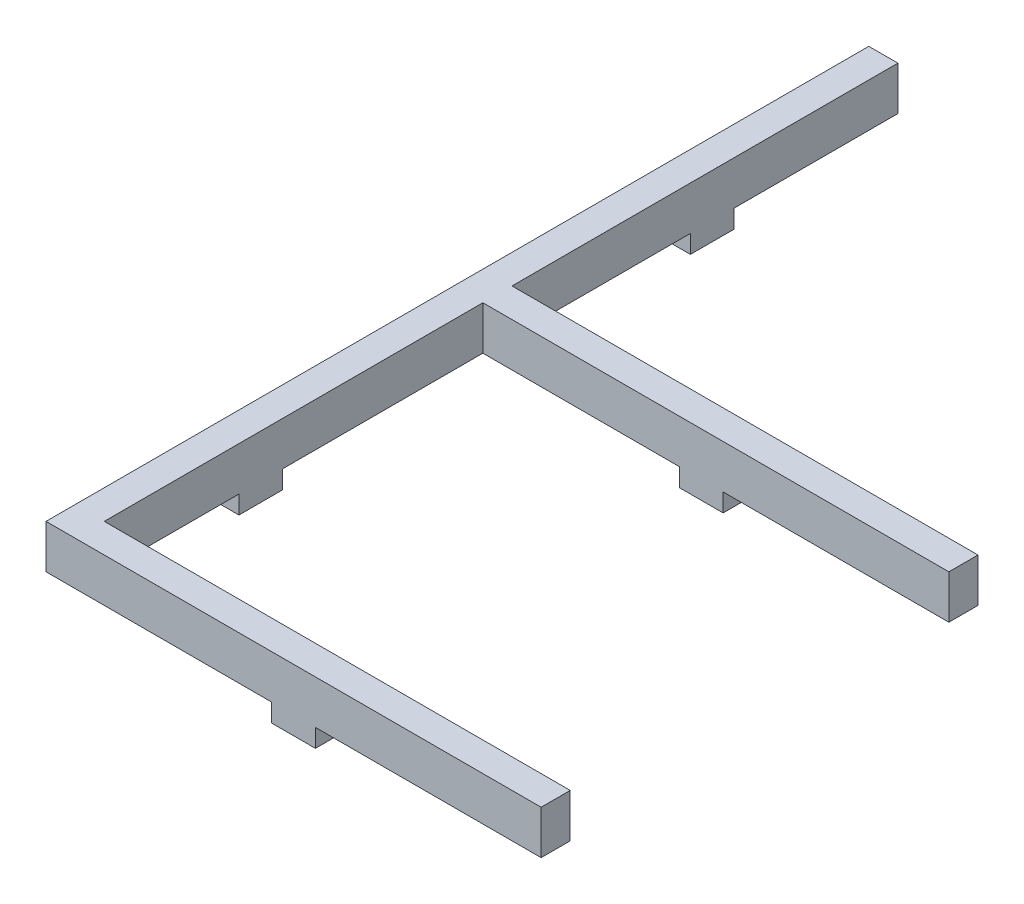
ISO-10303-21;
HEADER;
FILE_DESCRIPTION(('STEP AP214'),'2;1');
FILE_NAME('part.step','',(''),(''),'','','');
FILE_SCHEMA(('AUTOMOTIVE_DESIGN { 1 0 10303 214 1 1 1 1 }'));
ENDSEC;
DATA;
#1=APPLICATION_CONTEXT('core data for automotive mechanical design processes');
#2=APPLICATION_PROTOCOL_DEFINITION('international standard','automotive_design',2000,#1);
#3=PRODUCT_CONTEXT('',#1,'mechanical');
#4=PRODUCT('Part','Part','',(#3));
#5=PRODUCT_RELATED_PRODUCT_CATEGORY('part','',(#4));
#6=PRODUCT_DEFINITION_FORMATION('','',#4);
#7=PRODUCT_DEFINITION_CONTEXT('part definition',#1,'design');
#8=PRODUCT_DEFINITION('design','',#6,#7);
#9=PRODUCT_DEFINITION_SHAPE('','',#8);
#10=(LENGTH_UNIT() NAMED_UNIT(*) SI_UNIT(.MILLI.,.METRE.));
#11=(NAMED_UNIT(*) PLANE_ANGLE_UNIT() SI_UNIT($,.RADIAN.));
#12=(NAMED_UNIT(*) SI_UNIT($,.STERADIAN.) SOLID_ANGLE_UNIT());
#13=UNCERTAINTY_MEASURE_WITH_UNIT(LENGTH_MEASURE(1.E-05),#10,'distance_accuracy_value','');
#14=(GEOMETRIC_REPRESENTATION_CONTEXT(3) GLOBAL_UNCERTAINTY_ASSIGNED_CONTEXT((#13)) GLOBAL_UNIT_ASSIGNED_CONTEXT((#10,
#11,#12)) REPRESENTATION_CONTEXT('',''));
#15=CARTESIAN_POINT('',(0.,0.,0.));
#16=DIRECTION('',(0.,0.,1.));
#17=DIRECTION('',(1.,0.,0.));
#18=AXIS2_PLACEMENT_3D('',#15,#16,#17);
#19=CARTESIAN_POINT('',(0.,0.,0.));
#20=DIRECTION('',(0.,-1.,0.));
#21=DIRECTION('',(0.,0.,-1.));
#22=AXIS2_PLACEMENT_3D('',#19,#20,#21);
#23=PLANE('',#22);
#24=DIRECTION('',(-1.,0.,0.));
#25=VECTOR('',#24,1.);
#26=CARTESIAN_POINT('',(0.,0.,0.));
#27=LINE('',#26,#25);
#28=CARTESIAN_POINT('',(13.5,0.,0.));
#29=VERTEX_POINT('',#28);
#30=CARTESIAN_POINT('',(0.,0.,0.));
#31=VERTEX_POINT('',#30);
#32=EDGE_CURVE('E238',#29,#31,#27,.T.);
#33=ORIENTED_EDGE('',*,*,#32,.F.);
#34=DIRECTION('',(0.,0.,-1.));
#35=VECTOR('',#34,1.);
#36=CARTESIAN_POINT('',(13.5,0.,2.));
#37=LINE('',#36,#35);
#38=CARTESIAN_POINT('',(13.5,0.,2.));
#39=VERTEX_POINT('',#38);
#40=EDGE_CURVE('E223',#39,#29,#37,.T.);
#41=ORIENTED_EDGE('',*,*,#40,.F.);
#42=DIRECTION('',(1.,0.,0.));
#43=VECTOR('',#42,1.);
#44=CARTESIAN_POINT('',(0.,0.,2.));
#45=LINE('',#44,#43);
#46=CARTESIAN_POINT('',(0.,0.,2.));
#47=VERTEX_POINT('',#46);
#48=EDGE_CURVE('E236',#47,#39,#45,.T.);
#49=ORIENTED_EDGE('',*,*,#48,.F.);
#50=DIRECTION('',(0.,0.,-1.));
#51=VECTOR('',#50,1.);
#52=CARTESIAN_POINT('',(0.,0.,28.));
#53=LINE('',#52,#51);
#54=CARTESIAN_POINT('',(0.,0.,15.75));
#55=VERTEX_POINT('',#54);
#56=EDGE_CURVE('E512',#55,#47,#53,.T.);
#57=ORIENTED_EDGE('',*,*,#56,.F.);
#58=DIRECTION('',(-1.,0.,0.));
#59=VECTOR('',#58,1.);
#60=CARTESIAN_POINT('',(3.25,0.,15.75));
#61=LINE('',#60,#59);
#62=CARTESIAN_POINT('',(-1.99999999999999,0.,15.75));
#63=VERTEX_POINT('',#62);
#64=EDGE_CURVE('E415',#55,#63,#61,.T.);
#65=ORIENTED_EDGE('',*,*,#64,.T.);
#66=DIRECTION('',(0.,0.,1.));
#67=VECTOR('',#66,1.);
#68=CARTESIAN_POINT('',(-2.,0.,-26.5));
#69=LINE('',#68,#67);
#70=CARTESIAN_POINT('',(-2.,0.,-12.25));
#71=VERTEX_POINT('',#70);
#72=EDGE_CURVE('E316',#71,#63,#69,.T.);
#73=ORIENTED_EDGE('',*,*,#72,.F.);
#74=DIRECTION('',(-1.,0.,0.));
#75=VECTOR('',#74,1.);
#76=CARTESIAN_POINT('',(3.25,0.,-12.25));
#77=LINE('',#76,#75);
#78=CARTESIAN_POINT('',(0.,0.,-12.25));
#79=VERTEX_POINT('',#78);
#80=EDGE_CURVE('E374',#79,#71,#77,.T.);
#81=ORIENTED_EDGE('',*,*,#80,.F.);
#82=DIRECTION('',(0.,0.,-1.));
#83=VECTOR('',#82,1.);
#84=CARTESIAN_POINT('',(0.,0.,0.));
#85=LINE('',#84,#83);
#86=EDGE_CURVE('E329',#31,#79,#85,.T.);
#87=ORIENTED_EDGE('',*,*,#86,.F.);
#88=EDGE_LOOP('',(#33,#41,#49,#57,#65,#73,#81,#87));
#89=FACE_BOUND('',#88,.T.);
#90=ADVANCED_FACE('F45',(#89),#23,.T.);
#91=CARTESIAN_POINT('',(16.5,0.,2.));
#92=VERTEX_POINT('',#91);
#93=CARTESIAN_POINT('',(32.,0.,2.));
#94=VERTEX_POINT('',#93);
#95=EDGE_CURVE('E250',#92,#94,#45,.T.);
#96=ORIENTED_EDGE('',*,*,#95,.F.);
#97=DIRECTION('',(0.,0.,-1.));
#98=VECTOR('',#97,1.);
#99=CARTESIAN_POINT('',(16.5,0.,2.));
#100=LINE('',#99,#98);
#101=CARTESIAN_POINT('',(16.5,0.,0.));
#102=VERTEX_POINT('',#101);
#103=EDGE_CURVE('E240',#92,#102,#100,.T.);
#104=ORIENTED_EDGE('',*,*,#103,.T.);
#105=CARTESIAN_POINT('',(32.,0.,0.));
#106=VERTEX_POINT('',#105);
#107=EDGE_CURVE('E259',#106,#102,#27,.T.);
#108=ORIENTED_EDGE('',*,*,#107,.F.);
#109=DIRECTION('',(0.,0.,-1.));
#110=VECTOR('',#109,1.);
#111=CARTESIAN_POINT('',(32.,0.,0.));
#112=LINE('',#111,#110);
#113=EDGE_CURVE('E249',#94,#106,#112,.T.);
#114=ORIENTED_EDGE('',*,*,#113,.F.);
#115=EDGE_LOOP('',(#96,#104,#108,#114));
#116=FACE_BOUND('',#115,.T.);
#117=ADVANCED_FACE('F494',(#116),#23,.T.);
#118=DIRECTION('',(0.,0.,1.));
#119=VECTOR('',#118,1.);
#120=CARTESIAN_POINT('',(13.5,0.,28.));
#121=LINE('',#120,#119);
#122=CARTESIAN_POINT('',(13.5,0.,28.));
#123=VERTEX_POINT('',#122);
#124=CARTESIAN_POINT('',(13.5,0.,30.));
#125=VERTEX_POINT('',#124);
#126=EDGE_CURVE('E430',#123,#125,#121,.T.);
#127=ORIENTED_EDGE('',*,*,#126,.T.);
#128=DIRECTION('',(1.,0.,0.));
#129=VECTOR('',#128,1.);
#130=CARTESIAN_POINT('',(-1.99999999999999,0.,30.));
#131=LINE('',#130,#129);
#132=CARTESIAN_POINT('',(-1.99999999999999,0.,30.));
#133=VERTEX_POINT('',#132);
#134=EDGE_CURVE('E321',#133,#125,#131,.T.);
#135=ORIENTED_EDGE('',*,*,#134,.F.);
#136=CARTESIAN_POINT('',(-1.99999999999999,0.,18.75));
#137=VERTEX_POINT('',#136);
#138=EDGE_CURVE('E318',#137,#133,#69,.T.);
#139=ORIENTED_EDGE('',*,*,#138,.F.);
#140=DIRECTION('',(-1.,0.,0.));
#141=VECTOR('',#140,1.);
#142=CARTESIAN_POINT('',(3.25,0.,18.75));
#143=LINE('',#142,#141);
#144=CARTESIAN_POINT('',(0.,0.,18.75));
#145=VERTEX_POINT('',#144);
#146=EDGE_CURVE('E400',#145,#137,#143,.T.);
#147=ORIENTED_EDGE('',*,*,#146,.F.);
#148=CARTESIAN_POINT('',(0.,0.,28.));
#149=VERTEX_POINT('',#148);
#150=EDGE_CURVE('E255',#149,#145,#53,.T.);
#151=ORIENTED_EDGE('',*,*,#150,.F.);
#152=DIRECTION('',(-1.,0.,0.));
#153=VECTOR('',#152,1.);
#154=CARTESIAN_POINT('',(0.,0.,28.));
#155=LINE('',#154,#153);
#156=EDGE_CURVE('E519',#123,#149,#155,.T.);
#157=ORIENTED_EDGE('',*,*,#156,.F.);
#158=EDGE_LOOP('',(#127,#135,#139,#147,#151,#157));
#159=FACE_BOUND('',#158,.T.);
#160=ADVANCED_FACE('F533',(#159),#23,.T.);
#161=DIRECTION('',(0.,0.,1.));
#162=VECTOR('',#161,1.);
#163=CARTESIAN_POINT('',(16.5,0.,28.));
#164=LINE('',#163,#162);
#165=CARTESIAN_POINT('',(16.5,0.,28.));
#166=VERTEX_POINT('',#165);
#167=CARTESIAN_POINT('',(16.5,0.,30.));
#168=VERTEX_POINT('',#167);
#169=EDGE_CURVE('E438',#166,#168,#164,.T.);
#170=ORIENTED_EDGE('',*,*,#169,.F.);
#171=CARTESIAN_POINT('',(32.,0.,28.));
#172=VERTEX_POINT('',#171);
#173=EDGE_CURVE('E515',#172,#166,#155,.T.);
#174=ORIENTED_EDGE('',*,*,#173,.F.);
#175=DIRECTION('',(0.,0.,-1.));
#176=VECTOR('',#175,1.);
#177=CARTESIAN_POINT('',(32.,0.,30.));
#178=LINE('',#177,#176);
#179=CARTESIAN_POINT('',(32.,0.,30.));
#180=VERTEX_POINT('',#179);
#181=EDGE_CURVE('E523',#180,#172,#178,.T.);
#182=ORIENTED_EDGE('',*,*,#181,.F.);
#183=EDGE_CURVE('E315',#168,#180,#131,.T.);
#184=ORIENTED_EDGE('',*,*,#183,.F.);
#185=EDGE_LOOP('',(#170,#174,#182,#184));
#186=FACE_BOUND('',#185,.T.);
#187=ADVANCED_FACE('F549',(#186),#23,.T.);
#188=CARTESIAN_POINT('',(0.,0.,-15.25));
#189=VERTEX_POINT('',#188);
#190=CARTESIAN_POINT('',(0.,0.,-26.5));
#191=VERTEX_POINT('',#190);
#192=EDGE_CURVE('E332',#189,#191,#85,.T.);
#193=ORIENTED_EDGE('',*,*,#192,.F.);
#194=DIRECTION('',(-1.,0.,0.));
#195=VECTOR('',#194,1.);
#196=CARTESIAN_POINT('',(3.25,0.,-15.25));
#197=LINE('',#196,#195);
#198=CARTESIAN_POINT('',(-2.,0.,-15.25));
#199=VERTEX_POINT('',#198);
#200=EDGE_CURVE('E313',#189,#199,#197,.T.);
#201=ORIENTED_EDGE('',*,*,#200,.T.);
#202=CARTESIAN_POINT('',(-2.,0.,-26.5));
#203=VERTEX_POINT('',#202);
#204=EDGE_CURVE('E303',#203,#199,#69,.T.);
#205=ORIENTED_EDGE('',*,*,#204,.F.);
#206=DIRECTION('',(-1.,0.,0.));
#207=VECTOR('',#206,1.);
#208=CARTESIAN_POINT('',(-2.,0.,-26.5));
#209=LINE('',#208,#207);
#210=EDGE_CURVE('E311',#191,#203,#209,.T.);
#211=ORIENTED_EDGE('',*,*,#210,.F.);
#212=EDGE_LOOP('',(#193,#201,#205,#211));
#213=FACE_BOUND('',#212,.T.);
#214=ADVANCED_FACE('F310',(#213),#23,.T.);
#215=CARTESIAN_POINT('',(0.,3.,0.));
#216=DIRECTION('',(-1.,0.,0.));
#217=DIRECTION('',(0.,0.,1.));
#218=AXIS2_PLACEMENT_3D('',#215,#216,#217);
#219=PLANE('',#218);
#220=ORIENTED_EDGE('',*,*,#86,.T.);
#221=DIRECTION('',(0.,-1.,0.));
#222=VECTOR('',#221,1.);
#223=CARTESIAN_POINT('',(0.,0.,-12.25));
#224=LINE('',#223,#222);
#225=CARTESIAN_POINT('',(0.,-1.25,-12.25));
#226=VERTEX_POINT('',#225);
#227=EDGE_CURVE('E380',#79,#226,#224,.T.);
#228=ORIENTED_EDGE('',*,*,#227,.T.);
#229=DIRECTION('',(0.,0.,-1.));
#230=VECTOR('',#229,1.);
#231=CARTESIAN_POINT('',(0.,-1.25,-15.25));
#232=LINE('',#231,#230);
#233=CARTESIAN_POINT('',(0.,-1.25,-15.25));
#234=VERTEX_POINT('',#233);
#235=EDGE_CURVE('E363',#226,#234,#232,.T.);
#236=ORIENTED_EDGE('',*,*,#235,.T.);
#237=DIRECTION('',(0.,1.,0.));
#238=VECTOR('',#237,1.);
#239=CARTESIAN_POINT('',(0.,0.,-15.25));
#240=LINE('',#239,#238);
#241=EDGE_CURVE('E366',#234,#189,#240,.T.);
#242=ORIENTED_EDGE('',*,*,#241,.T.);
#243=ORIENTED_EDGE('',*,*,#192,.T.);
#244=DIRECTION('',(0.,-1.,0.));
#245=VECTOR('',#244,1.);
#246=CARTESIAN_POINT('',(0.,3.,-26.5));
#247=LINE('',#246,#245);
#248=CARTESIAN_POINT('',(0.,3.,-26.5));
#249=VERTEX_POINT('',#248);
#250=EDGE_CURVE('E11',#249,#191,#247,.T.);
#251=ORIENTED_EDGE('',*,*,#250,.F.);
#252=DIRECTION('',(0.,0.,-1.));
#253=VECTOR('',#252,1.);
#254=CARTESIAN_POINT('',(0.,3.,0.));
#255=LINE('',#254,#253);
#256=CARTESIAN_POINT('',(0.,3.,0.));
#257=VERTEX_POINT('',#256);
#258=EDGE_CURVE('E263',#257,#249,#255,.T.);
#259=ORIENTED_EDGE('',*,*,#258,.F.);
#260=DIRECTION('',(0.,-1.,0.));
#261=VECTOR('',#260,1.);
#262=CARTESIAN_POINT('',(0.,3.,0.));
#263=LINE('',#262,#261);
#264=EDGE_CURVE('E264',#257,#31,#263,.T.);
#265=ORIENTED_EDGE('',*,*,#264,.T.);
#266=EDGE_LOOP('',(#220,#228,#236,#242,#243,#251,#259,#265));
#267=FACE_BOUND('',#266,.T.);
#268=ADVANCED_FACE('F47',(#267),#219,.F.);
#269=CARTESIAN_POINT('',(-2.,3.,-26.5));
#270=DIRECTION('',(0.,0.,1.));
#271=DIRECTION('',(1.,0.,0.));
#272=AXIS2_PLACEMENT_3D('',#269,#270,#271);
#273=PLANE('',#272);
#274=ORIENTED_EDGE('',*,*,#210,.T.);
#275=DIRECTION('',(0.,-1.,0.));
#276=VECTOR('',#275,1.);
#277=CARTESIAN_POINT('',(-2.,3.,-26.5));
#278=LINE('',#277,#276);
#279=CARTESIAN_POINT('',(-2.,3.,-26.5));
#280=VERTEX_POINT('',#279);
#281=EDGE_CURVE('E54',#280,#203,#278,.T.);
#282=ORIENTED_EDGE('',*,*,#281,.F.);
#283=DIRECTION('',(-1.,0.,0.));
#284=VECTOR('',#283,1.);
#285=CARTESIAN_POINT('',(-2.,3.,-26.5));
#286=LINE('',#285,#284);
#287=EDGE_CURVE('E357',#249,#280,#286,.T.);
#288=ORIENTED_EDGE('',*,*,#287,.F.);
#289=ORIENTED_EDGE('',*,*,#250,.T.);
#290=EDGE_LOOP('',(#274,#282,#288,#289));
#291=FACE_BOUND('',#290,.T.);
#292=ADVANCED_FACE('F574',(#291),#273,.F.);
#293=CARTESIAN_POINT('',(-2.,3.,-26.5));
#294=DIRECTION('',(1.,0.,0.));
#295=DIRECTION('',(0.,0.,-1.));
#296=AXIS2_PLACEMENT_3D('',#293,#294,#295);
#297=PLANE('',#296);
#298=ORIENTED_EDGE('',*,*,#204,.T.);
#299=DIRECTION('',(0.,-1.,0.));
#300=VECTOR('',#299,1.);
#301=CARTESIAN_POINT('',(-2.,0.,-15.25));
#302=LINE('',#301,#300);
#303=CARTESIAN_POINT('',(-2.,-1.25,-15.25));
#304=VERTEX_POINT('',#303);
#305=EDGE_CURVE('E388',#199,#304,#302,.T.);
#306=ORIENTED_EDGE('',*,*,#305,.T.);
#307=DIRECTION('',(0.,0.,1.));
#308=VECTOR('',#307,1.);
#309=CARTESIAN_POINT('',(-2.,-1.25,-15.25));
#310=LINE('',#309,#308);
#311=CARTESIAN_POINT('',(-2.,-1.25,-12.25));
#312=VERTEX_POINT('',#311);
#313=EDGE_CURVE('E384',#304,#312,#310,.T.);
#314=ORIENTED_EDGE('',*,*,#313,.T.);
#315=DIRECTION('',(0.,1.,0.));
#316=VECTOR('',#315,1.);
#317=CARTESIAN_POINT('',(-2.,0.,-12.25));
#318=LINE('',#317,#316);
#319=EDGE_CURVE('E371',#312,#71,#318,.T.);
#320=ORIENTED_EDGE('',*,*,#319,.T.);
#321=ORIENTED_EDGE('',*,*,#72,.T.);
#322=DIRECTION('',(0.,-1.,0.));
#323=VECTOR('',#322,1.);
#324=CARTESIAN_POINT('',(-1.99999999999999,0.,15.75));
#325=LINE('',#324,#323);
#326=CARTESIAN_POINT('',(-1.99999999999999,-1.25,15.75));
#327=VERTEX_POINT('',#326);
#328=EDGE_CURVE('E391',#63,#327,#325,.T.);
#329=ORIENTED_EDGE('',*,*,#328,.T.);
#330=DIRECTION('',(0.,0.,1.));
#331=VECTOR('',#330,1.);
#332=CARTESIAN_POINT('',(-1.99999999999999,-1.25,18.75));
#333=LINE('',#332,#331);
#334=CARTESIAN_POINT('',(-1.99999999999999,-1.25,18.75));
#335=VERTEX_POINT('',#334);
#336=EDGE_CURVE('E408',#327,#335,#333,.T.);
#337=ORIENTED_EDGE('',*,*,#336,.T.);
#338=DIRECTION('',(0.,1.,0.));
#339=VECTOR('',#338,1.);
#340=CARTESIAN_POINT('',(-1.99999999999999,0.,18.75));
#341=LINE('',#340,#339);
#342=EDGE_CURVE('E412',#335,#137,#341,.T.);
#343=ORIENTED_EDGE('',*,*,#342,.T.);
#344=ORIENTED_EDGE('',*,*,#138,.T.);
#345=DIRECTION('',(0.,-1.,0.));
#346=VECTOR('',#345,1.);
#347=CARTESIAN_POINT('',(-1.99999999999999,3.,30.));
#348=LINE('',#347,#346);
#349=CARTESIAN_POINT('',(-1.99999999999999,3.,30.));
#350=VERTEX_POINT('',#349);
#351=EDGE_CURVE('E291',#350,#133,#348,.T.);
#352=ORIENTED_EDGE('',*,*,#351,.F.);
#353=DIRECTION('',(0.,0.,1.));
#354=VECTOR('',#353,1.);
#355=CARTESIAN_POINT('',(-2.,3.,-26.5));
#356=LINE('',#355,#354);
#357=EDGE_CURVE('E306',#280,#350,#356,.T.);
#358=ORIENTED_EDGE('',*,*,#357,.F.);
#359=ORIENTED_EDGE('',*,*,#281,.T.);
#360=EDGE_LOOP('',(#298,#306,#314,#320,#321,#329,#337,#343,#344,#352,#358,#359));
#361=FACE_BOUND('',#360,.T.);
#362=ADVANCED_FACE('F301',(#361),#297,.F.);
#363=CARTESIAN_POINT('',(-1.99999999999999,3.,30.));
#364=DIRECTION('',(0.,0.,-1.));
#365=DIRECTION('',(-1.,0.,0.));
#366=AXIS2_PLACEMENT_3D('',#363,#364,#365);
#367=PLANE('',#366);
#368=ORIENTED_EDGE('',*,*,#134,.T.);
#369=DIRECTION('',(0.,-1.,0.));
#370=VECTOR('',#369,1.);
#371=CARTESIAN_POINT('',(13.5,-1.25,30.));
#372=LINE('',#371,#370);
#373=CARTESIAN_POINT('',(13.5,-1.25,30.));
#374=VERTEX_POINT('',#373);
#375=EDGE_CURVE('E452',#125,#374,#372,.T.);
#376=ORIENTED_EDGE('',*,*,#375,.T.);
#377=DIRECTION('',(1.,0.,0.));
#378=VECTOR('',#377,1.);
#379=CARTESIAN_POINT('',(16.5,-1.25,30.));
#380=LINE('',#379,#378);
#381=CARTESIAN_POINT('',(16.5,-1.25,30.));
#382=VERTEX_POINT('',#381);
#383=EDGE_CURVE('E448',#374,#382,#380,.T.);
#384=ORIENTED_EDGE('',*,*,#383,.T.);
#385=DIRECTION('',(0.,1.,0.));
#386=VECTOR('',#385,1.);
#387=CARTESIAN_POINT('',(16.5,-1.25,30.));
#388=LINE('',#387,#386);
#389=EDGE_CURVE('E444',#382,#168,#388,.T.);
#390=ORIENTED_EDGE('',*,*,#389,.T.);
#391=ORIENTED_EDGE('',*,*,#183,.T.);
#392=DIRECTION('',(0.,-1.,0.));
#393=VECTOR('',#392,1.);
#394=CARTESIAN_POINT('',(32.,3.,30.));
#395=LINE('',#394,#393);
#396=CARTESIAN_POINT('',(32.,3.,30.));
#397=VERTEX_POINT('',#396);
#398=EDGE_CURVE('E287',#397,#180,#395,.T.);
#399=ORIENTED_EDGE('',*,*,#398,.F.);
#400=DIRECTION('',(1.,0.,0.));
#401=VECTOR('',#400,1.);
#402=CARTESIAN_POINT('',(-1.99999999999999,3.,30.));
#403=LINE('',#402,#401);
#404=EDGE_CURVE('E352',#350,#397,#403,.T.);
#405=ORIENTED_EDGE('',*,*,#404,.F.);
#406=ORIENTED_EDGE('',*,*,#351,.T.);
#407=EDGE_LOOP('',(#368,#376,#384,#390,#391,#399,#405,#406));
#408=FACE_BOUND('',#407,.T.);
#409=ADVANCED_FACE('F530',(#408),#367,.F.);
#410=CARTESIAN_POINT('',(32.,3.,30.));
#411=DIRECTION('',(-1.,0.,0.));
#412=DIRECTION('',(0.,0.,1.));
#413=AXIS2_PLACEMENT_3D('',#410,#411,#412);
#414=PLANE('',#413);
#415=ORIENTED_EDGE('',*,*,#181,.T.);
#416=DIRECTION('',(0.,-1.,0.));
#417=VECTOR('',#416,1.);
#418=CARTESIAN_POINT('',(32.,3.,28.));
#419=LINE('',#418,#417);
#420=CARTESIAN_POINT('',(32.,3.,28.));
#421=VERTEX_POINT('',#420);
#422=EDGE_CURVE('E283',#421,#172,#419,.T.);
#423=ORIENTED_EDGE('',*,*,#422,.F.);
#424=DIRECTION('',(0.,0.,-1.));
#425=VECTOR('',#424,1.);
#426=CARTESIAN_POINT('',(32.,3.,30.));
#427=LINE('',#426,#425);
#428=EDGE_CURVE('E349',#397,#421,#427,.T.);
#429=ORIENTED_EDGE('',*,*,#428,.F.);
#430=ORIENTED_EDGE('',*,*,#398,.T.);
#431=EDGE_LOOP('',(#415,#423,#429,#430));
#432=FACE_BOUND('',#431,.T.);
#433=ADVANCED_FACE('F552',(#432),#414,.F.);
#434=CARTESIAN_POINT('',(0.,3.,28.));
#435=DIRECTION('',(0.,0.,1.));
#436=DIRECTION('',(1.,0.,0.));
#437=AXIS2_PLACEMENT_3D('',#434,#435,#436);
#438=PLANE('',#437);
#439=ORIENTED_EDGE('',*,*,#173,.T.);
#440=DIRECTION('',(0.,1.,0.));
#441=VECTOR('',#440,1.);
#442=CARTESIAN_POINT('',(16.5,-1.25,28.));
#443=LINE('',#442,#441);
#444=CARTESIAN_POINT('',(16.5,-1.25,28.));
#445=VERTEX_POINT('',#444);
#446=EDGE_CURVE('E435',#445,#166,#443,.T.);
#447=ORIENTED_EDGE('',*,*,#446,.F.);
#448=DIRECTION('',(1.,0.,0.));
#449=VECTOR('',#448,1.);
#450=CARTESIAN_POINT('',(16.5,-1.25,28.));
#451=LINE('',#450,#449);
#452=CARTESIAN_POINT('',(13.5,-1.25,28.));
#453=VERTEX_POINT('',#452);
#454=EDGE_CURVE('E458',#453,#445,#451,.T.);
#455=ORIENTED_EDGE('',*,*,#454,.F.);
#456=DIRECTION('',(0.,-1.,0.));
#457=VECTOR('',#456,1.);
#458=CARTESIAN_POINT('',(13.5,-1.25,28.));
#459=LINE('',#458,#457);
#460=EDGE_CURVE('E69',#123,#453,#459,.T.);
#461=ORIENTED_EDGE('',*,*,#460,.F.);
#462=ORIENTED_EDGE('',*,*,#156,.T.);
#463=DIRECTION('',(0.,-1.,0.));
#464=VECTOR('',#463,1.);
#465=CARTESIAN_POINT('',(0.,3.,28.));
#466=LINE('',#465,#464);
#467=CARTESIAN_POINT('',(0.,3.,28.));
#468=VERTEX_POINT('',#467);
#469=EDGE_CURVE('E279',#468,#149,#466,.T.);
#470=ORIENTED_EDGE('',*,*,#469,.F.);
#471=DIRECTION('',(-1.,0.,0.));
#472=VECTOR('',#471,1.);
#473=CARTESIAN_POINT('',(0.,3.,28.));
#474=LINE('',#473,#472);
#475=EDGE_CURVE('E346',#421,#468,#474,.T.);
#476=ORIENTED_EDGE('',*,*,#475,.F.);
#477=ORIENTED_EDGE('',*,*,#422,.T.);
#478=EDGE_LOOP('',(#439,#447,#455,#461,#462,#470,#476,#477));
#479=FACE_BOUND('',#478,.T.);
#480=ADVANCED_FACE('F554',(#479),#438,.F.);
#481=CARTESIAN_POINT('',(0.,3.,28.));
#482=DIRECTION('',(-1.,0.,0.));
#483=DIRECTION('',(0.,0.,1.));
#484=AXIS2_PLACEMENT_3D('',#481,#482,#483);
#485=PLANE('',#484);
#486=ORIENTED_EDGE('',*,*,#150,.T.);
#487=DIRECTION('',(0.,-1.,0.));
#488=VECTOR('',#487,1.);
#489=CARTESIAN_POINT('',(0.,0.,18.75));
#490=LINE('',#489,#488);
#491=CARTESIAN_POINT('',(0.,-1.25,18.75));
#492=VERTEX_POINT('',#491);
#493=EDGE_CURVE('E401',#145,#492,#490,.T.);
#494=ORIENTED_EDGE('',*,*,#493,.T.);
#495=DIRECTION('',(0.,0.,-1.));
#496=VECTOR('',#495,1.);
#497=CARTESIAN_POINT('',(0.,-1.25,18.75));
#498=LINE('',#497,#496);
#499=CARTESIAN_POINT('',(0.,-1.25,15.75));
#500=VERTEX_POINT('',#499);
#501=EDGE_CURVE('E397',#492,#500,#498,.T.);
#502=ORIENTED_EDGE('',*,*,#501,.T.);
#503=DIRECTION('',(0.,1.,0.));
#504=VECTOR('',#503,1.);
#505=CARTESIAN_POINT('',(0.,0.,15.75));
#506=LINE('',#505,#504);
#507=EDGE_CURVE('E404',#500,#55,#506,.T.);
#508=ORIENTED_EDGE('',*,*,#507,.T.);
#509=ORIENTED_EDGE('',*,*,#56,.T.);
#510=DIRECTION('',(0.,-1.,0.));
#511=VECTOR('',#510,1.);
#512=CARTESIAN_POINT('',(0.,3.,2.));
#513=LINE('',#512,#511);
#514=CARTESIAN_POINT('',(0.,3.,2.));
#515=VERTEX_POINT('',#514);
#516=EDGE_CURVE('E247',#515,#47,#513,.T.);
#517=ORIENTED_EDGE('',*,*,#516,.F.);
#518=DIRECTION('',(0.,0.,-1.));
#519=VECTOR('',#518,1.);
#520=CARTESIAN_POINT('',(0.,3.,28.));
#521=LINE('',#520,#519);
#522=EDGE_CURVE('E343',#468,#515,#521,.T.);
#523=ORIENTED_EDGE('',*,*,#522,.F.);
#524=ORIENTED_EDGE('',*,*,#469,.T.);
#525=EDGE_LOOP('',(#486,#494,#502,#508,#509,#517,#523,#524));
#526=FACE_BOUND('',#525,.T.);
#527=ADVANCED_FACE('F511',(#526),#485,.F.);
#528=CARTESIAN_POINT('',(0.,3.,2.));
#529=DIRECTION('',(0.,0.,-1.));
#530=DIRECTION('',(-1.,0.,0.));
#531=AXIS2_PLACEMENT_3D('',#528,#529,#530);
#532=PLANE('',#531);
#533=ORIENTED_EDGE('',*,*,#48,.T.);
#534=DIRECTION('',(0.,-1.,0.));
#535=VECTOR('',#534,1.);
#536=CARTESIAN_POINT('',(13.5,-1.25,2.));
#537=LINE('',#536,#535);
#538=CARTESIAN_POINT('',(13.5,-1.25,2.));
#539=VERTEX_POINT('',#538);
#540=EDGE_CURVE('E220',#39,#539,#537,.T.);
#541=ORIENTED_EDGE('',*,*,#540,.T.);
#542=DIRECTION('',(1.,0.,0.));
#543=VECTOR('',#542,1.);
#544=CARTESIAN_POINT('',(16.5,-1.25,2.));
#545=LINE('',#544,#543);
#546=CARTESIAN_POINT('',(16.5,-1.25,2.));
#547=VERTEX_POINT('',#546);
#548=EDGE_CURVE('E241',#539,#547,#545,.T.);
#549=ORIENTED_EDGE('',*,*,#548,.T.);
#550=DIRECTION('',(0.,1.,0.));
#551=VECTOR('',#550,1.);
#552=CARTESIAN_POINT('',(16.5,-1.25,2.));
#553=LINE('',#552,#551);
#554=EDGE_CURVE('E230',#547,#92,#553,.T.);
#555=ORIENTED_EDGE('',*,*,#554,.T.);
#556=ORIENTED_EDGE('',*,*,#95,.T.);
#557=DIRECTION('',(0.,-1.,0.));
#558=VECTOR('',#557,1.);
#559=CARTESIAN_POINT('',(32.,3.,2.));
#560=LINE('',#559,#558);
#561=CARTESIAN_POINT('',(32.,3.,2.));
#562=VERTEX_POINT('',#561);
#563=EDGE_CURVE('E273',#562,#94,#560,.T.);
#564=ORIENTED_EDGE('',*,*,#563,.F.);
#565=DIRECTION('',(1.,0.,0.));
#566=VECTOR('',#565,1.);
#567=CARTESIAN_POINT('',(0.,3.,2.));
#568=LINE('',#567,#566);
#569=EDGE_CURVE('E340',#515,#562,#568,.T.);
#570=ORIENTED_EDGE('',*,*,#569,.F.);
#571=ORIENTED_EDGE('',*,*,#516,.T.);
#572=EDGE_LOOP('',(#533,#541,#549,#555,#556,#564,#570,#571));
#573=FACE_BOUND('',#572,.T.);
#574=ADVANCED_FACE('F244',(#573),#532,.F.);
#575=CARTESIAN_POINT('',(32.,3.,0.));
#576=DIRECTION('',(-1.,0.,0.));
#577=DIRECTION('',(0.,0.,1.));
#578=AXIS2_PLACEMENT_3D('',#575,#576,#577);
#579=PLANE('',#578);
#580=ORIENTED_EDGE('',*,*,#113,.T.);
#581=DIRECTION('',(0.,-1.,0.));
#582=VECTOR('',#581,1.);
#583=CARTESIAN_POINT('',(32.,3.,0.));
#584=LINE('',#583,#582);
#585=CARTESIAN_POINT('',(32.,3.,0.));
#586=VERTEX_POINT('',#585);
#587=EDGE_CURVE('E268',#586,#106,#584,.T.);
#588=ORIENTED_EDGE('',*,*,#587,.F.);
#589=DIRECTION('',(0.,0.,-1.));
#590=VECTOR('',#589,1.);
#591=CARTESIAN_POINT('',(32.,3.,0.));
#592=LINE('',#591,#590);
#593=EDGE_CURVE('E337',#562,#586,#592,.T.);
#594=ORIENTED_EDGE('',*,*,#593,.F.);
#595=ORIENTED_EDGE('',*,*,#563,.T.);
#596=EDGE_LOOP('',(#580,#588,#594,#595));
#597=FACE_BOUND('',#596,.T.);
#598=ADVANCED_FACE('F497',(#597),#579,.F.);
#599=CARTESIAN_POINT('',(0.,3.,0.));
#600=DIRECTION('',(0.,0.,1.));
#601=DIRECTION('',(1.,0.,0.));
#602=AXIS2_PLACEMENT_3D('',#599,#600,#601);
#603=PLANE('',#602);
#604=ORIENTED_EDGE('',*,*,#107,.T.);
#605=DIRECTION('',(0.,1.,0.));
#606=VECTOR('',#605,1.);
#607=CARTESIAN_POINT('',(16.5,-1.25,0.));
#608=LINE('',#607,#606);
#609=CARTESIAN_POINT('',(16.5,-1.25,0.));
#610=VERTEX_POINT('',#609);
#611=EDGE_CURVE('E475',#610,#102,#608,.T.);
#612=ORIENTED_EDGE('',*,*,#611,.F.);
#613=DIRECTION('',(1.,0.,0.));
#614=VECTOR('',#613,1.);
#615=CARTESIAN_POINT('',(16.5,-1.25,0.));
#616=LINE('',#615,#614);
#617=CARTESIAN_POINT('',(13.5,-1.25,0.));
#618=VERTEX_POINT('',#617);
#619=EDGE_CURVE('E231',#618,#610,#616,.T.);
#620=ORIENTED_EDGE('',*,*,#619,.F.);
#621=DIRECTION('',(0.,-1.,0.));
#622=VECTOR('',#621,1.);
#623=CARTESIAN_POINT('',(13.5,-1.25,0.));
#624=LINE('',#623,#622);
#625=EDGE_CURVE('E61',#29,#618,#624,.T.);
#626=ORIENTED_EDGE('',*,*,#625,.F.);
#627=ORIENTED_EDGE('',*,*,#32,.T.);
#628=ORIENTED_EDGE('',*,*,#264,.F.);
#629=DIRECTION('',(-1.,0.,0.));
#630=VECTOR('',#629,1.);
#631=CARTESIAN_POINT('',(0.,3.,0.));
#632=LINE('',#631,#630);
#633=EDGE_CURVE('E269',#586,#257,#632,.T.);
#634=ORIENTED_EDGE('',*,*,#633,.F.);
#635=ORIENTED_EDGE('',*,*,#587,.T.);
#636=EDGE_LOOP('',(#604,#612,#620,#626,#627,#628,#634,#635));
#637=FACE_BOUND('',#636,.T.);
#638=ADVANCED_FACE('F500',(#637),#603,.F.);
#639=CARTESIAN_POINT('',(0.,3.,0.));
#640=DIRECTION('',(0.,-1.,0.));
#641=DIRECTION('',(0.,0.,-1.));
#642=AXIS2_PLACEMENT_3D('',#639,#640,#641);
#643=PLANE('',#642);
#644=ORIENTED_EDGE('',*,*,#258,.T.);
#645=ORIENTED_EDGE('',*,*,#287,.T.);
#646=ORIENTED_EDGE('',*,*,#357,.T.);
#647=ORIENTED_EDGE('',*,*,#404,.T.);
#648=ORIENTED_EDGE('',*,*,#428,.T.);
#649=ORIENTED_EDGE('',*,*,#475,.T.);
#650=ORIENTED_EDGE('',*,*,#522,.T.);
#651=ORIENTED_EDGE('',*,*,#569,.T.);
#652=ORIENTED_EDGE('',*,*,#593,.T.);
#653=ORIENTED_EDGE('',*,*,#633,.T.);
#654=EDGE_LOOP('',(#644,#645,#646,#647,#648,#649,#650,#651,#652,#653));
#655=FACE_BOUND('',#654,.T.);
#656=ADVANCED_FACE('F504',(#655),#643,.F.);
#657=CARTESIAN_POINT('',(3.25,0.,-15.25));
#658=DIRECTION('',(0.,0.,-1.));
#659=DIRECTION('',(-1.,0.,0.));
#660=AXIS2_PLACEMENT_3D('',#657,#658,#659);
#661=PLANE('',#660);
#662=ORIENTED_EDGE('',*,*,#241,.F.);
#663=DIRECTION('',(-1.,0.,0.));
#664=VECTOR('',#663,1.);
#665=CARTESIAN_POINT('',(3.25,-1.25,-15.25));
#666=LINE('',#665,#664);
#667=EDGE_CURVE('E367',#234,#304,#666,.T.);
#668=ORIENTED_EDGE('',*,*,#667,.T.);
#669=ORIENTED_EDGE('',*,*,#305,.F.);
#670=ORIENTED_EDGE('',*,*,#200,.F.);
#671=EDGE_LOOP('',(#662,#668,#669,#670));
#672=FACE_BOUND('',#671,.T.);
#673=ADVANCED_FACE('F639',(#672),#661,.T.);
#674=CARTESIAN_POINT('',(3.25,0.,-12.25));
#675=DIRECTION('',(0.,0.,1.));
#676=DIRECTION('',(1.,0.,0.));
#677=AXIS2_PLACEMENT_3D('',#674,#675,#676);
#678=PLANE('',#677);
#679=ORIENTED_EDGE('',*,*,#227,.F.);
#680=ORIENTED_EDGE('',*,*,#80,.T.);
#681=ORIENTED_EDGE('',*,*,#319,.F.);
#682=DIRECTION('',(-1.,0.,0.));
#683=VECTOR('',#682,1.);
#684=CARTESIAN_POINT('',(3.25,-1.25,-12.25));
#685=LINE('',#684,#683);
#686=EDGE_CURVE('E370',#226,#312,#685,.T.);
#687=ORIENTED_EDGE('',*,*,#686,.F.);
#688=EDGE_LOOP('',(#679,#680,#681,#687));
#689=FACE_BOUND('',#688,.T.);
#690=ADVANCED_FACE('F571',(#689),#678,.T.);
#691=CARTESIAN_POINT('',(3.25,-1.25,-15.25));
#692=DIRECTION('',(0.,-1.,0.));
#693=DIRECTION('',(0.,0.,-1.));
#694=AXIS2_PLACEMENT_3D('',#691,#692,#693);
#695=PLANE('',#694);
#696=ORIENTED_EDGE('',*,*,#235,.F.);
#697=ORIENTED_EDGE('',*,*,#686,.T.);
#698=ORIENTED_EDGE('',*,*,#313,.F.);
#699=ORIENTED_EDGE('',*,*,#667,.F.);
#700=EDGE_LOOP('',(#696,#697,#698,#699));
#701=FACE_BOUND('',#700,.T.);
#702=ADVANCED_FACE('F623',(#701),#695,.T.);
#703=CARTESIAN_POINT('',(3.25,0.,18.75));
#704=DIRECTION('',(0.,0.,1.));
#705=DIRECTION('',(1.,0.,0.));
#706=AXIS2_PLACEMENT_3D('',#703,#704,#705);
#707=PLANE('',#706);
#708=ORIENTED_EDGE('',*,*,#493,.F.);
#709=ORIENTED_EDGE('',*,*,#146,.T.);
#710=ORIENTED_EDGE('',*,*,#342,.F.);
#711=DIRECTION('',(-1.,0.,0.));
#712=VECTOR('',#711,1.);
#713=CARTESIAN_POINT('',(3.25,-1.25,18.75));
#714=LINE('',#713,#712);
#715=EDGE_CURVE('E418',#492,#335,#714,.T.);
#716=ORIENTED_EDGE('',*,*,#715,.F.);
#717=EDGE_LOOP('',(#708,#709,#710,#716));
#718=FACE_BOUND('',#717,.T.);
#719=ADVANCED_FACE('F557',(#718),#707,.T.);
#720=CARTESIAN_POINT('',(3.25,-1.25,18.75));
#721=DIRECTION('',(0.,-1.,0.));
#722=DIRECTION('',(0.,0.,-1.));
#723=AXIS2_PLACEMENT_3D('',#720,#721,#722);
#724=PLANE('',#723);
#725=ORIENTED_EDGE('',*,*,#501,.F.);
#726=ORIENTED_EDGE('',*,*,#715,.T.);
#727=ORIENTED_EDGE('',*,*,#336,.F.);
#728=DIRECTION('',(-1.,0.,0.));
#729=VECTOR('',#728,1.);
#730=CARTESIAN_POINT('',(3.25,-1.25,15.75));
#731=LINE('',#730,#729);
#732=EDGE_CURVE('E421',#500,#327,#731,.T.);
#733=ORIENTED_EDGE('',*,*,#732,.F.);
#734=EDGE_LOOP('',(#725,#726,#727,#733));
#735=FACE_BOUND('',#734,.T.);
#736=ADVANCED_FACE('F563',(#735),#724,.T.);
#737=CARTESIAN_POINT('',(3.25,0.,15.75));
#738=DIRECTION('',(0.,0.,-1.));
#739=DIRECTION('',(-1.,0.,0.));
#740=AXIS2_PLACEMENT_3D('',#737,#738,#739);
#741=PLANE('',#740);
#742=ORIENTED_EDGE('',*,*,#507,.F.);
#743=ORIENTED_EDGE('',*,*,#732,.T.);
#744=ORIENTED_EDGE('',*,*,#328,.F.);
#745=ORIENTED_EDGE('',*,*,#64,.F.);
#746=EDGE_LOOP('',(#742,#743,#744,#745));
#747=FACE_BOUND('',#746,.T.);
#748=ADVANCED_FACE('F565',(#747),#741,.T.);
#749=CARTESIAN_POINT('',(13.5,-1.25,28.));
#750=DIRECTION('',(-1.,0.,0.));
#751=DIRECTION('',(0.,0.,1.));
#752=AXIS2_PLACEMENT_3D('',#749,#750,#751);
#753=PLANE('',#752);
#754=ORIENTED_EDGE('',*,*,#375,.F.);
#755=ORIENTED_EDGE('',*,*,#126,.F.);
#756=ORIENTED_EDGE('',*,*,#460,.T.);
#757=DIRECTION('',(0.,0.,1.));
#758=VECTOR('',#757,1.);
#759=CARTESIAN_POINT('',(13.5,-1.25,28.));
#760=LINE('',#759,#758);
#761=EDGE_CURVE('E431',#453,#374,#760,.T.);
#762=ORIENTED_EDGE('',*,*,#761,.T.);
#763=EDGE_LOOP('',(#754,#755,#756,#762));
#764=FACE_BOUND('',#763,.T.);
#765=ADVANCED_FACE('F538',(#764),#753,.T.);
#766=CARTESIAN_POINT('',(16.5,-1.25,28.));
#767=DIRECTION('',(1.,0.,0.));
#768=DIRECTION('',(0.,0.,-1.));
#769=AXIS2_PLACEMENT_3D('',#766,#767,#768);
#770=PLANE('',#769);
#771=ORIENTED_EDGE('',*,*,#389,.F.);
#772=DIRECTION('',(0.,0.,1.));
#773=VECTOR('',#772,1.);
#774=CARTESIAN_POINT('',(16.5,-1.25,28.));
#775=LINE('',#774,#773);
#776=EDGE_CURVE('E434',#445,#382,#775,.T.);
#777=ORIENTED_EDGE('',*,*,#776,.F.);
#778=ORIENTED_EDGE('',*,*,#446,.T.);
#779=ORIENTED_EDGE('',*,*,#169,.T.);
#780=EDGE_LOOP('',(#771,#777,#778,#779));
#781=FACE_BOUND('',#780,.T.);
#782=ADVANCED_FACE('F765',(#781),#770,.T.);
#783=CARTESIAN_POINT('',(16.5,-1.25,28.));
#784=DIRECTION('',(0.,-1.,0.));
#785=DIRECTION('',(1.,0.,0.));
#786=AXIS2_PLACEMENT_3D('',#783,#784,#785);
#787=PLANE('',#786);
#788=ORIENTED_EDGE('',*,*,#383,.F.);
#789=ORIENTED_EDGE('',*,*,#761,.F.);
#790=ORIENTED_EDGE('',*,*,#454,.T.);
#791=ORIENTED_EDGE('',*,*,#776,.T.);
#792=EDGE_LOOP('',(#788,#789,#790,#791));
#793=FACE_BOUND('',#792,.T.);
#794=ADVANCED_FACE('F541',(#793),#787,.T.);
#795=CARTESIAN_POINT('',(13.5,-1.25,2.));
#796=DIRECTION('',(1.,0.,0.));
#797=DIRECTION('',(0.,0.,-1.));
#798=AXIS2_PLACEMENT_3D('',#795,#796,#797);
#799=PLANE('',#798);
#800=ORIENTED_EDGE('',*,*,#625,.T.);
#801=DIRECTION('',(0.,0.,-1.));
#802=VECTOR('',#801,1.);
#803=CARTESIAN_POINT('',(13.5,-1.25,2.));
#804=LINE('',#803,#802);
#805=EDGE_CURVE('E226',#539,#618,#804,.T.);
#806=ORIENTED_EDGE('',*,*,#805,.F.);
#807=ORIENTED_EDGE('',*,*,#540,.F.);
#808=ORIENTED_EDGE('',*,*,#40,.T.);
#809=EDGE_LOOP('',(#800,#806,#807,#808));
#810=FACE_BOUND('',#809,.T.);
#811=ADVANCED_FACE('F222',(#810),#799,.F.);
#812=CARTESIAN_POINT('',(16.5,-1.25,2.));
#813=DIRECTION('',(0.,1.,0.));
#814=DIRECTION('',(-1.,0.,0.));
#815=AXIS2_PLACEMENT_3D('',#812,#813,#814);
#816=PLANE('',#815);
#817=ORIENTED_EDGE('',*,*,#619,.T.);
#818=DIRECTION('',(0.,0.,-1.));
#819=VECTOR('',#818,1.);
#820=CARTESIAN_POINT('',(16.5,-1.25,2.));
#821=LINE('',#820,#819);
#822=EDGE_CURVE('E467',#547,#610,#821,.T.);
#823=ORIENTED_EDGE('',*,*,#822,.F.);
#824=ORIENTED_EDGE('',*,*,#548,.F.);
#825=ORIENTED_EDGE('',*,*,#805,.T.);
#826=EDGE_LOOP('',(#817,#823,#824,#825));
#827=FACE_BOUND('',#826,.T.);
#828=ADVANCED_FACE('F794',(#827),#816,.F.);
#829=CARTESIAN_POINT('',(16.5,-1.25,2.));
#830=DIRECTION('',(-1.,0.,0.));
#831=DIRECTION('',(0.,0.,1.));
#832=AXIS2_PLACEMENT_3D('',#829,#830,#831);
#833=PLANE('',#832);
#834=ORIENTED_EDGE('',*,*,#611,.T.);
#835=ORIENTED_EDGE('',*,*,#103,.F.);
#836=ORIENTED_EDGE('',*,*,#554,.F.);
#837=ORIENTED_EDGE('',*,*,#822,.T.);
#838=EDGE_LOOP('',(#834,#835,#836,#837));
#839=FACE_BOUND('',#838,.T.);
#840=ADVANCED_FACE('F489',(#839),#833,.F.);
#841=CLOSED_SHELL('',(#90,#117,#160,#187,#214,#268,#292,#362,#409,#433,#480,#527,#574,#598,#638,
#656,#673,#690,#702,#719,#736,#748,#765,#782,#794,#811,#828,#840));
#842=MANIFOLD_SOLID_BREP('B2',#841);
#843=ADVANCED_BREP_SHAPE_REPRESENTATION('',(#18,#842),#14);
#844=SHAPE_DEFINITION_REPRESENTATION(#9,#843);
ENDSEC;
END-ISO-10303-21;
